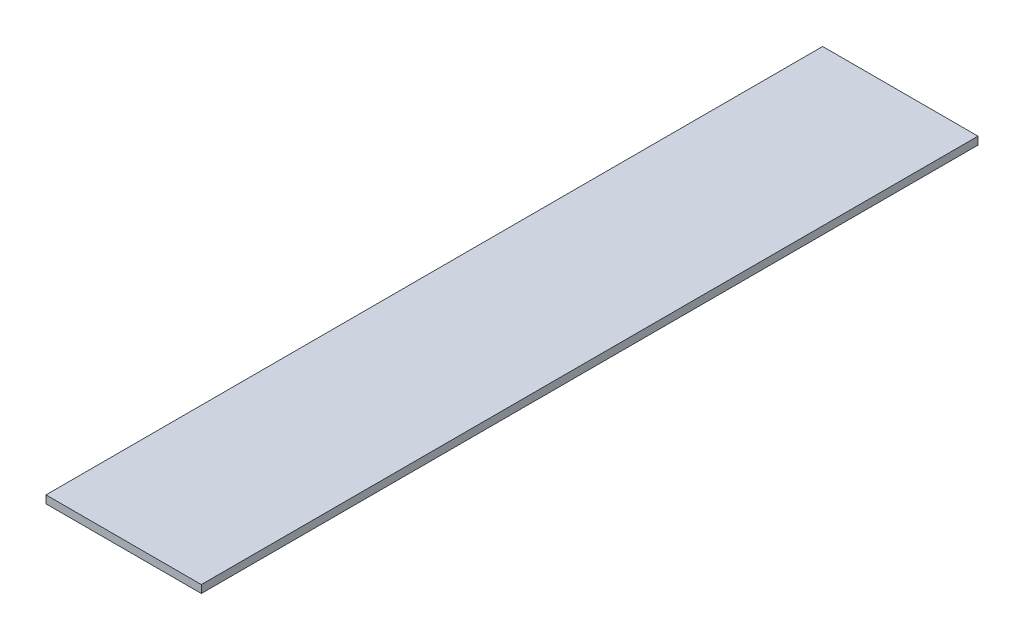
ISO-10303-21;
HEADER;
FILE_DESCRIPTION(('STEP AP214'),'2;1');
FILE_NAME('part.step','',(''),(''),'','','');
FILE_SCHEMA(('AUTOMOTIVE_DESIGN { 1 0 10303 214 1 1 1 1 }'));
ENDSEC;
DATA;
#1=APPLICATION_CONTEXT('core data for automotive mechanical design processes');
#2=APPLICATION_PROTOCOL_DEFINITION('international standard','automotive_design',2000,#1);
#3=PRODUCT_CONTEXT('',#1,'mechanical');
#4=PRODUCT('Part','Part','',(#3));
#5=PRODUCT_RELATED_PRODUCT_CATEGORY('part','',(#4));
#6=PRODUCT_DEFINITION_FORMATION('','',#4);
#7=PRODUCT_DEFINITION_CONTEXT('part definition',#1,'design');
#8=PRODUCT_DEFINITION('design','',#6,#7);
#9=PRODUCT_DEFINITION_SHAPE('','',#8);
#10=(LENGTH_UNIT() NAMED_UNIT(*) SI_UNIT(.MILLI.,.METRE.));
#11=(NAMED_UNIT(*) PLANE_ANGLE_UNIT() SI_UNIT($,.RADIAN.));
#12=(NAMED_UNIT(*) SI_UNIT($,.STERADIAN.) SOLID_ANGLE_UNIT());
#13=UNCERTAINTY_MEASURE_WITH_UNIT(LENGTH_MEASURE(1.E-05),#10,'distance_accuracy_value','');
#14=(GEOMETRIC_REPRESENTATION_CONTEXT(3) GLOBAL_UNCERTAINTY_ASSIGNED_CONTEXT((#13)) GLOBAL_UNIT_ASSIGNED_CONTEXT((#10,
#11,#12)) REPRESENTATION_CONTEXT('',''));
#15=CARTESIAN_POINT('',(0.,0.,0.));
#16=DIRECTION('',(0.,0.,1.));
#17=DIRECTION('',(1.,0.,0.));
#18=AXIS2_PLACEMENT_3D('',#15,#16,#17);
#19=CARTESIAN_POINT('',(40.,2.,0.));
#20=DIRECTION('',(0.,0.,-1.));
#21=DIRECTION('',(-1.,0.,0.));
#22=AXIS2_PLACEMENT_3D('',#19,#20,#21);
#23=PLANE('',#22);
#24=DIRECTION('',(1.,0.,0.));
#25=VECTOR('',#24,1.);
#26=CARTESIAN_POINT('',(40.,0.,0.));
#27=LINE('',#26,#25);
#28=CARTESIAN_POINT('',(0.,0.,0.));
#29=VERTEX_POINT('',#28);
#30=CARTESIAN_POINT('',(40.,0.,0.));
#31=VERTEX_POINT('',#30);
#32=EDGE_CURVE('E96',#29,#31,#27,.T.);
#33=ORIENTED_EDGE('',*,*,#32,.T.);
#34=DIRECTION('',(0.,-1.,0.));
#35=VECTOR('',#34,1.);
#36=CARTESIAN_POINT('',(40.,2.,0.));
#37=LINE('',#36,#35);
#38=CARTESIAN_POINT('',(40.,2.,0.));
#39=VERTEX_POINT('',#38);
#40=EDGE_CURVE('E11',#39,#31,#37,.T.);
#41=ORIENTED_EDGE('',*,*,#40,.F.);
#42=DIRECTION('',(1.,0.,0.));
#43=VECTOR('',#42,1.);
#44=CARTESIAN_POINT('',(40.,2.,0.));
#45=LINE('',#44,#43);
#46=CARTESIAN_POINT('',(0.,2.,0.));
#47=VERTEX_POINT('',#46);
#48=EDGE_CURVE('E84',#47,#39,#45,.T.);
#49=ORIENTED_EDGE('',*,*,#48,.F.);
#50=DIRECTION('',(0.,-1.,0.));
#51=VECTOR('',#50,1.);
#52=CARTESIAN_POINT('',(0.,2.,0.));
#53=LINE('',#52,#51);
#54=EDGE_CURVE('E92',#47,#29,#53,.T.);
#55=ORIENTED_EDGE('',*,*,#54,.T.);
#56=EDGE_LOOP('',(#33,#41,#49,#55));
#57=FACE_BOUND('',#56,.T.);
#58=ADVANCED_FACE('F33',(#57),#23,.F.);
#59=CARTESIAN_POINT('',(40.,2.,-200.));
#60=DIRECTION('',(-1.,0.,0.));
#61=DIRECTION('',(0.,0.,1.));
#62=AXIS2_PLACEMENT_3D('',#59,#60,#61);
#63=PLANE('',#62);
#64=DIRECTION('',(0.,0.,-1.));
#65=VECTOR('',#64,1.);
#66=CARTESIAN_POINT('',(40.,0.,-200.));
#67=LINE('',#66,#65);
#68=CARTESIAN_POINT('',(40.,0.,-200.));
#69=VERTEX_POINT('',#68);
#70=EDGE_CURVE('E88',#31,#69,#67,.T.);
#71=ORIENTED_EDGE('',*,*,#70,.T.);
#72=DIRECTION('',(0.,-1.,0.));
#73=VECTOR('',#72,1.);
#74=CARTESIAN_POINT('',(40.,2.,-200.));
#75=LINE('',#74,#73);
#76=CARTESIAN_POINT('',(40.,2.,-200.));
#77=VERTEX_POINT('',#76);
#78=EDGE_CURVE('E41',#77,#69,#75,.T.);
#79=ORIENTED_EDGE('',*,*,#78,.F.);
#80=DIRECTION('',(0.,0.,-1.));
#81=VECTOR('',#80,1.);
#82=CARTESIAN_POINT('',(40.,2.,-200.));
#83=LINE('',#82,#81);
#84=EDGE_CURVE('E79',#39,#77,#83,.T.);
#85=ORIENTED_EDGE('',*,*,#84,.F.);
#86=ORIENTED_EDGE('',*,*,#40,.T.);
#87=EDGE_LOOP('',(#71,#79,#85,#86));
#88=FACE_BOUND('',#87,.T.);
#89=ADVANCED_FACE('F87',(#88),#63,.F.);
#90=CARTESIAN_POINT('',(0.,2.,-200.));
#91=DIRECTION('',(0.,0.,1.));
#92=DIRECTION('',(1.,0.,0.));
#93=AXIS2_PLACEMENT_3D('',#90,#91,#92);
#94=PLANE('',#93);
#95=DIRECTION('',(-1.,0.,0.));
#96=VECTOR('',#95,1.);
#97=CARTESIAN_POINT('',(0.,0.,-200.));
#98=LINE('',#97,#96);
#99=CARTESIAN_POINT('',(0.,0.,-200.));
#100=VERTEX_POINT('',#99);
#101=EDGE_CURVE('E66',#69,#100,#98,.T.);
#102=ORIENTED_EDGE('',*,*,#101,.T.);
#103=DIRECTION('',(0.,-1.,0.));
#104=VECTOR('',#103,1.);
#105=CARTESIAN_POINT('',(0.,2.,-200.));
#106=LINE('',#105,#104);
#107=CARTESIAN_POINT('',(0.,2.,-200.));
#108=VERTEX_POINT('',#107);
#109=EDGE_CURVE('E89',#108,#100,#106,.T.);
#110=ORIENTED_EDGE('',*,*,#109,.F.);
#111=DIRECTION('',(-1.,0.,0.));
#112=VECTOR('',#111,1.);
#113=CARTESIAN_POINT('',(0.,2.,-200.));
#114=LINE('',#113,#112);
#115=EDGE_CURVE('E82',#77,#108,#114,.T.);
#116=ORIENTED_EDGE('',*,*,#115,.F.);
#117=ORIENTED_EDGE('',*,*,#78,.T.);
#118=EDGE_LOOP('',(#102,#110,#116,#117));
#119=FACE_BOUND('',#118,.T.);
#120=ADVANCED_FACE('F90',(#119),#94,.F.);
#121=CARTESIAN_POINT('',(0.,2.,0.));
#122=DIRECTION('',(1.,0.,0.));
#123=DIRECTION('',(0.,0.,-1.));
#124=AXIS2_PLACEMENT_3D('',#121,#122,#123);
#125=PLANE('',#124);
#126=DIRECTION('',(0.,0.,1.));
#127=VECTOR('',#126,1.);
#128=CARTESIAN_POINT('',(0.,0.,0.));
#129=LINE('',#128,#127);
#130=EDGE_CURVE('E72',#100,#29,#129,.T.);
#131=ORIENTED_EDGE('',*,*,#130,.T.);
#132=ORIENTED_EDGE('',*,*,#54,.F.);
#133=DIRECTION('',(0.,0.,1.));
#134=VECTOR('',#133,1.);
#135=CARTESIAN_POINT('',(0.,2.,0.));
#136=LINE('',#135,#134);
#137=EDGE_CURVE('E49',#108,#47,#136,.T.);
#138=ORIENTED_EDGE('',*,*,#137,.F.);
#139=ORIENTED_EDGE('',*,*,#109,.T.);
#140=EDGE_LOOP('',(#131,#132,#138,#139));
#141=FACE_BOUND('',#140,.T.);
#142=ADVANCED_FACE('F103',(#141),#125,.F.);
#143=CARTESIAN_POINT('',(0.,2.,0.));
#144=DIRECTION('',(0.,-1.,0.));
#145=DIRECTION('',(0.,0.,-1.));
#146=AXIS2_PLACEMENT_3D('',#143,#144,#145);
#147=PLANE('',#146);
#148=ORIENTED_EDGE('',*,*,#48,.T.);
#149=ORIENTED_EDGE('',*,*,#84,.T.);
#150=ORIENTED_EDGE('',*,*,#115,.T.);
#151=ORIENTED_EDGE('',*,*,#137,.T.);
#152=EDGE_LOOP('',(#148,#149,#150,#151));
#153=FACE_BOUND('',#152,.T.);
#154=ADVANCED_FACE('F80',(#153),#147,.F.);
#155=CARTESIAN_POINT('',(0.,0.,0.));
#156=DIRECTION('',(0.,-1.,0.));
#157=DIRECTION('',(0.,0.,-1.));
#158=AXIS2_PLACEMENT_3D('',#155,#156,#157);
#159=PLANE('',#158);
#160=ORIENTED_EDGE('',*,*,#32,.F.);
#161=ORIENTED_EDGE('',*,*,#130,.F.);
#162=ORIENTED_EDGE('',*,*,#101,.F.);
#163=ORIENTED_EDGE('',*,*,#70,.F.);
#164=EDGE_LOOP('',(#160,#161,#162,#163));
#165=FACE_BOUND('',#164,.T.);
#166=ADVANCED_FACE('F106',(#165),#159,.T.);
#167=CLOSED_SHELL('',(#58,#89,#120,#142,#154,#166));
#168=MANIFOLD_SOLID_BREP('B2',#167);
#169=ADVANCED_BREP_SHAPE_REPRESENTATION('',(#18,#168),#14);
#170=SHAPE_DEFINITION_REPRESENTATION(#9,#169);
ENDSEC;
END-ISO-10303-21;
